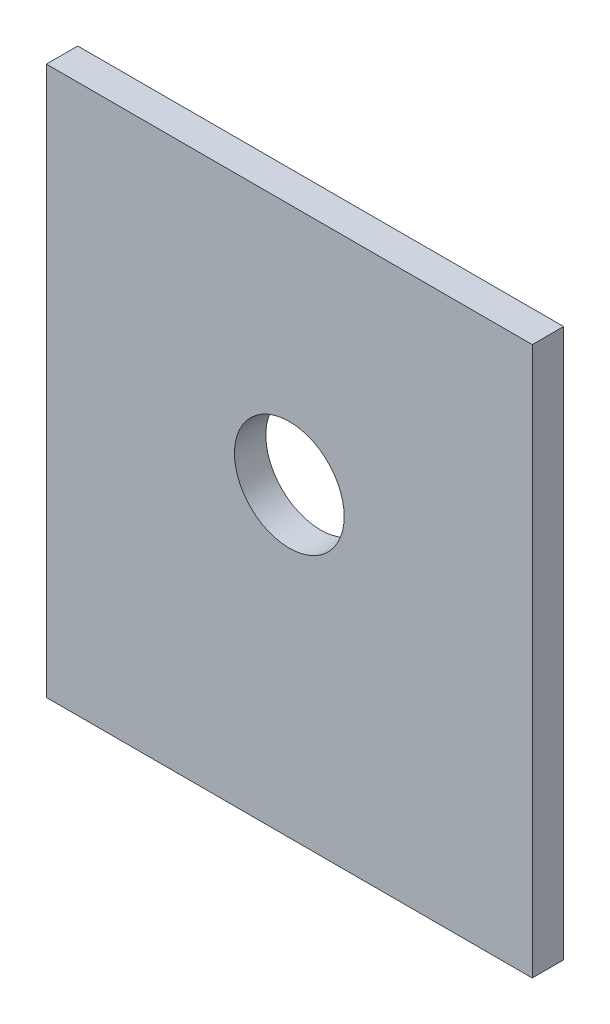
ISO-10303-21;
HEADER;
FILE_DESCRIPTION(('STEP AP214'),'2;1');
FILE_NAME('part.step','',(''),(''),'','','');
FILE_SCHEMA(('AUTOMOTIVE_DESIGN { 1 0 10303 214 1 1 1 1 }'));
ENDSEC;
DATA;
#1=APPLICATION_CONTEXT('core data for automotive mechanical design processes');
#2=APPLICATION_PROTOCOL_DEFINITION('international standard','automotive_design',2000,#1);
#3=PRODUCT_CONTEXT('',#1,'mechanical');
#4=PRODUCT('Part','Part','',(#3));
#5=PRODUCT_RELATED_PRODUCT_CATEGORY('part','',(#4));
#6=PRODUCT_DEFINITION_FORMATION('','',#4);
#7=PRODUCT_DEFINITION_CONTEXT('part definition',#1,'design');
#8=PRODUCT_DEFINITION('design','',#6,#7);
#9=PRODUCT_DEFINITION_SHAPE('','',#8);
#10=(LENGTH_UNIT() NAMED_UNIT(*) SI_UNIT(.MILLI.,.METRE.));
#11=(NAMED_UNIT(*) PLANE_ANGLE_UNIT() SI_UNIT($,.RADIAN.));
#12=(NAMED_UNIT(*) SI_UNIT($,.STERADIAN.) SOLID_ANGLE_UNIT());
#13=UNCERTAINTY_MEASURE_WITH_UNIT(LENGTH_MEASURE(1.E-05),#10,'distance_accuracy_value','');
#14=(GEOMETRIC_REPRESENTATION_CONTEXT(3) GLOBAL_UNCERTAINTY_ASSIGNED_CONTEXT((#13)) GLOBAL_UNIT_ASSIGNED_CONTEXT((#10,
#11,#12)) REPRESENTATION_CONTEXT('',''));
#15=CARTESIAN_POINT('',(0.,0.,0.));
#16=DIRECTION('',(0.,0.,1.));
#17=DIRECTION('',(1.,0.,0.));
#18=AXIS2_PLACEMENT_3D('',#15,#16,#17);
#19=CARTESIAN_POINT('',(0.,0.,4.));
#20=DIRECTION('',(0.,0.,1.));
#21=DIRECTION('',(1.,0.,0.));
#22=AXIS2_PLACEMENT_3D('',#19,#20,#21);
#23=PLANE('',#22);
#24=DIRECTION('',(0.,-1.,0.));
#25=VECTOR('',#24,1.);
#26=CARTESIAN_POINT('',(-10.,52.,4.));
#27=LINE('',#26,#25);
#28=CARTESIAN_POINT('',(-10.,52.,4.));
#29=VERTEX_POINT('',#28);
#30=CARTESIAN_POINT('',(-10.,-18.,4.));
#31=VERTEX_POINT('',#30);
#32=EDGE_CURVE('E86',#29,#31,#27,.T.);
#33=ORIENTED_EDGE('',*,*,#32,.T.);
#34=DIRECTION('',(1.,0.,0.));
#35=VECTOR('',#34,1.);
#36=CARTESIAN_POINT('',(-10.,-18.,4.));
#37=LINE('',#36,#35);
#38=CARTESIAN_POINT('',(52.,-18.,4.));
#39=VERTEX_POINT('',#38);
#40=EDGE_CURVE('E81',#31,#39,#37,.T.);
#41=ORIENTED_EDGE('',*,*,#40,.T.);
#42=DIRECTION('',(0.,1.,0.));
#43=VECTOR('',#42,1.);
#44=CARTESIAN_POINT('',(52.,52.,4.));
#45=LINE('',#44,#43);
#46=CARTESIAN_POINT('',(52.,52.,4.));
#47=VERTEX_POINT('',#46);
#48=EDGE_CURVE('E84',#39,#47,#45,.T.);
#49=ORIENTED_EDGE('',*,*,#48,.T.);
#50=DIRECTION('',(-1.,0.,0.));
#51=VECTOR('',#50,1.);
#52=CARTESIAN_POINT('',(-10.,52.,4.));
#53=LINE('',#52,#51);
#54=EDGE_CURVE('E51',#47,#29,#53,.T.);
#55=ORIENTED_EDGE('',*,*,#54,.T.);
#56=EDGE_LOOP('',(#33,#41,#49,#55));
#57=FACE_BOUND('',#56,.T.);
#58=CARTESIAN_POINT('',(21.,21.,4.));
#59=DIRECTION('',(0.,0.,1.));
#60=DIRECTION('',(1.,0.,0.));
#61=AXIS2_PLACEMENT_3D('',#58,#59,#60);
#62=CIRCLE('',#61,7.);
#63=CARTESIAN_POINT('',(28.,21.,4.));
#64=VERTEX_POINT('',#63);
#65=EDGE_CURVE('E101',#64,#64,#62,.T.);
#66=ORIENTED_EDGE('',*,*,#65,.F.);
#67=EDGE_LOOP('',(#66));
#68=FACE_BOUND('',#67,.T.);
#69=ADVANCED_FACE('F34',(#57,#68),#23,.T.);
#70=CARTESIAN_POINT('',(0.,0.,0.));
#71=DIRECTION('',(0.,0.,1.));
#72=DIRECTION('',(1.,0.,0.));
#73=AXIS2_PLACEMENT_3D('',#70,#71,#72);
#74=PLANE('',#73);
#75=DIRECTION('',(0.,-1.,0.));
#76=VECTOR('',#75,1.);
#77=CARTESIAN_POINT('',(-10.,52.,0.));
#78=LINE('',#77,#76);
#79=CARTESIAN_POINT('',(-10.,52.,0.));
#80=VERTEX_POINT('',#79);
#81=CARTESIAN_POINT('',(-10.,-18.,0.));
#82=VERTEX_POINT('',#81);
#83=EDGE_CURVE('E98',#80,#82,#78,.T.);
#84=ORIENTED_EDGE('',*,*,#83,.F.);
#85=DIRECTION('',(-1.,0.,0.));
#86=VECTOR('',#85,1.);
#87=CARTESIAN_POINT('',(-10.,52.,0.));
#88=LINE('',#87,#86);
#89=CARTESIAN_POINT('',(52.,52.,0.));
#90=VERTEX_POINT('',#89);
#91=EDGE_CURVE('E74',#90,#80,#88,.T.);
#92=ORIENTED_EDGE('',*,*,#91,.F.);
#93=DIRECTION('',(0.,1.,0.));
#94=VECTOR('',#93,1.);
#95=CARTESIAN_POINT('',(52.,52.,0.));
#96=LINE('',#95,#94);
#97=CARTESIAN_POINT('',(52.,-18.,0.));
#98=VERTEX_POINT('',#97);
#99=EDGE_CURVE('E68',#98,#90,#96,.T.);
#100=ORIENTED_EDGE('',*,*,#99,.F.);
#101=DIRECTION('',(1.,0.,0.));
#102=VECTOR('',#101,1.);
#103=CARTESIAN_POINT('',(-10.,-18.,0.));
#104=LINE('',#103,#102);
#105=EDGE_CURVE('E90',#82,#98,#104,.T.);
#106=ORIENTED_EDGE('',*,*,#105,.F.);
#107=EDGE_LOOP('',(#84,#92,#100,#106));
#108=FACE_BOUND('',#107,.T.);
#109=CARTESIAN_POINT('',(21.,21.,0.));
#110=DIRECTION('',(0.,0.,1.));
#111=DIRECTION('',(1.,0.,0.));
#112=AXIS2_PLACEMENT_3D('',#109,#110,#111);
#113=CIRCLE('',#112,7.);
#114=CARTESIAN_POINT('',(28.,21.,0.));
#115=VERTEX_POINT('',#114);
#116=EDGE_CURVE('E113',#115,#115,#113,.T.);
#117=ORIENTED_EDGE('',*,*,#116,.T.);
#118=EDGE_LOOP('',(#117));
#119=FACE_BOUND('',#118,.T.);
#120=ADVANCED_FACE('F109',(#108,#119),#74,.F.);
#121=CARTESIAN_POINT('',(-10.,52.,4.));
#122=DIRECTION('',(1.,0.,0.));
#123=DIRECTION('',(0.,1.,0.));
#124=AXIS2_PLACEMENT_3D('',#121,#122,#123);
#125=PLANE('',#124);
#126=ORIENTED_EDGE('',*,*,#83,.T.);
#127=DIRECTION('',(0.,0.,-1.));
#128=VECTOR('',#127,1.);
#129=CARTESIAN_POINT('',(-10.,-18.,4.));
#130=LINE('',#129,#128);
#131=EDGE_CURVE('E11',#31,#82,#130,.T.);
#132=ORIENTED_EDGE('',*,*,#131,.F.);
#133=ORIENTED_EDGE('',*,*,#32,.F.);
#134=DIRECTION('',(0.,0.,-1.));
#135=VECTOR('',#134,1.);
#136=CARTESIAN_POINT('',(-10.,52.,4.));
#137=LINE('',#136,#135);
#138=EDGE_CURVE('E94',#29,#80,#137,.T.);
#139=ORIENTED_EDGE('',*,*,#138,.T.);
#140=EDGE_LOOP('',(#126,#132,#133,#139));
#141=FACE_BOUND('',#140,.T.);
#142=ADVANCED_FACE('F36',(#141),#125,.F.);
#143=CARTESIAN_POINT('',(-10.,-18.,4.));
#144=DIRECTION('',(0.,1.,0.));
#145=DIRECTION('',(0.,0.,1.));
#146=AXIS2_PLACEMENT_3D('',#143,#144,#145);
#147=PLANE('',#146);
#148=ORIENTED_EDGE('',*,*,#105,.T.);
#149=DIRECTION('',(0.,0.,-1.));
#150=VECTOR('',#149,1.);
#151=CARTESIAN_POINT('',(52.,-18.,4.));
#152=LINE('',#151,#150);
#153=EDGE_CURVE('E43',#39,#98,#152,.T.);
#154=ORIENTED_EDGE('',*,*,#153,.F.);
#155=ORIENTED_EDGE('',*,*,#40,.F.);
#156=ORIENTED_EDGE('',*,*,#131,.T.);
#157=EDGE_LOOP('',(#148,#154,#155,#156));
#158=FACE_BOUND('',#157,.T.);
#159=ADVANCED_FACE('F89',(#158),#147,.F.);
#160=CARTESIAN_POINT('',(52.,52.,4.));
#161=DIRECTION('',(-1.,0.,0.));
#162=DIRECTION('',(0.,-1.,0.));
#163=AXIS2_PLACEMENT_3D('',#160,#161,#162);
#164=PLANE('',#163);
#165=ORIENTED_EDGE('',*,*,#99,.T.);
#166=DIRECTION('',(0.,0.,-1.));
#167=VECTOR('',#166,1.);
#168=CARTESIAN_POINT('',(52.,52.,4.));
#169=LINE('',#168,#167);
#170=EDGE_CURVE('E91',#47,#90,#169,.T.);
#171=ORIENTED_EDGE('',*,*,#170,.F.);
#172=ORIENTED_EDGE('',*,*,#48,.F.);
#173=ORIENTED_EDGE('',*,*,#153,.T.);
#174=EDGE_LOOP('',(#165,#171,#172,#173));
#175=FACE_BOUND('',#174,.T.);
#176=ADVANCED_FACE('F92',(#175),#164,.F.);
#177=CARTESIAN_POINT('',(-10.,52.,4.));
#178=DIRECTION('',(0.,-1.,0.));
#179=DIRECTION('',(0.,0.,-1.));
#180=AXIS2_PLACEMENT_3D('',#177,#178,#179);
#181=PLANE('',#180);
#182=ORIENTED_EDGE('',*,*,#91,.T.);
#183=ORIENTED_EDGE('',*,*,#138,.F.);
#184=ORIENTED_EDGE('',*,*,#54,.F.);
#185=ORIENTED_EDGE('',*,*,#170,.T.);
#186=EDGE_LOOP('',(#182,#183,#184,#185));
#187=FACE_BOUND('',#186,.T.);
#188=ADVANCED_FACE('F106',(#187),#181,.F.);
#189=CARTESIAN_POINT('',(21.,21.,4.));
#190=DIRECTION('',(0.,0.,-1.));
#191=DIRECTION('',(-1.,0.,0.));
#192=AXIS2_PLACEMENT_3D('',#189,#190,#191);
#193=CYLINDRICAL_SURFACE('',#192,7.);
#194=ORIENTED_EDGE('',*,*,#65,.T.);
#195=EDGE_LOOP('',(#194));
#196=FACE_BOUND('',#195,.T.);
#197=ORIENTED_EDGE('',*,*,#116,.F.);
#198=EDGE_LOOP('',(#197));
#199=FACE_BOUND('',#198,.T.);
#200=ADVANCED_FACE('F119',(#196,#199),#193,.F.);
#201=CLOSED_SHELL('',(#69,#120,#142,#159,#176,#188,#200));
#202=MANIFOLD_SOLID_BREP('B2',#201);
#203=ADVANCED_BREP_SHAPE_REPRESENTATION('',(#18,#202),#14);
#204=SHAPE_DEFINITION_REPRESENTATION(#9,#203);
ENDSEC;
END-ISO-10303-21;
